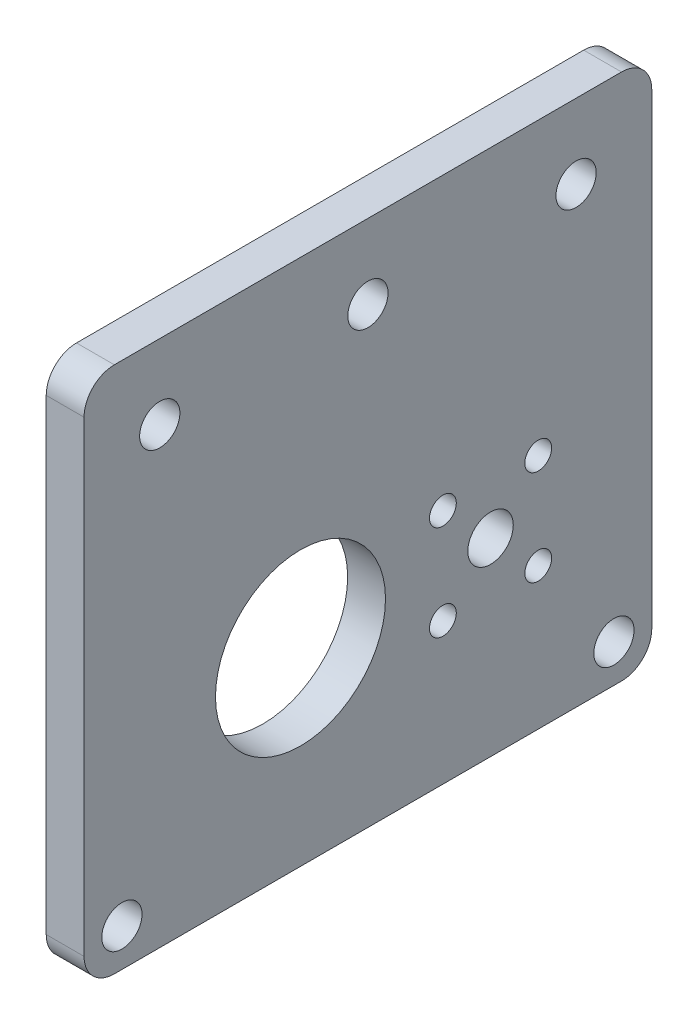
ISO-10303-21;
HEADER;
FILE_DESCRIPTION(('STEP AP214'),'2;1');
FILE_NAME('part.step','',(''),(''),'','','');
FILE_SCHEMA(('AUTOMOTIVE_DESIGN { 1 0 10303 214 1 1 1 1 }'));
ENDSEC;
DATA;
#1=APPLICATION_CONTEXT('core data for automotive mechanical design processes');
#2=APPLICATION_PROTOCOL_DEFINITION('international standard','automotive_design',2000,#1);
#3=PRODUCT_CONTEXT('',#1,'mechanical');
#4=PRODUCT('Part','Part','',(#3));
#5=PRODUCT_RELATED_PRODUCT_CATEGORY('part','',(#4));
#6=PRODUCT_DEFINITION_FORMATION('','',#4);
#7=PRODUCT_DEFINITION_CONTEXT('part definition',#1,'design');
#8=PRODUCT_DEFINITION('design','',#6,#7);
#9=PRODUCT_DEFINITION_SHAPE('','',#8);
#10=(LENGTH_UNIT() NAMED_UNIT(*) SI_UNIT(.MILLI.,.METRE.));
#11=(NAMED_UNIT(*) PLANE_ANGLE_UNIT() SI_UNIT($,.RADIAN.));
#12=(NAMED_UNIT(*) SI_UNIT($,.STERADIAN.) SOLID_ANGLE_UNIT());
#13=UNCERTAINTY_MEASURE_WITH_UNIT(LENGTH_MEASURE(1.E-05),#10,'distance_accuracy_value','');
#14=(GEOMETRIC_REPRESENTATION_CONTEXT(3) GLOBAL_UNCERTAINTY_ASSIGNED_CONTEXT((#13)) GLOBAL_UNIT_ASSIGNED_CONTEXT((#10,
#11,#12)) REPRESENTATION_CONTEXT('',''));
#15=CARTESIAN_POINT('',(0.,0.,0.));
#16=DIRECTION('',(0.,0.,1.));
#17=DIRECTION('',(1.,0.,0.));
#18=AXIS2_PLACEMENT_3D('',#15,#16,#17);
#19=CARTESIAN_POINT('',(6.35,0.,-27.05));
#20=DIRECTION('',(0.,0.,-1.));
#21=DIRECTION('',(0.,1.,0.));
#22=AXIS2_PLACEMENT_3D('',#19,#20,#21);
#23=PLANE('',#22);
#24=DIRECTION('',(0.,-1.,0.));
#25=VECTOR('',#24,1.);
#26=CARTESIAN_POINT('',(6.35,0.,-27.05));
#27=LINE('',#26,#25);
#28=CARTESIAN_POINT('',(6.35,51.67,-27.05));
#29=VERTEX_POINT('',#28);
#30=CARTESIAN_POINT('',(6.35,-26.67,-27.05));
#31=VERTEX_POINT('',#30);
#32=EDGE_CURVE('E168',#29,#31,#27,.T.);
#33=ORIENTED_EDGE('',*,*,#32,.T.);
#34=DIRECTION('',(-1.,0.,0.));
#35=VECTOR('',#34,1.);
#36=CARTESIAN_POINT('',(0.,-26.67,-27.05));
#37=LINE('',#36,#35);
#38=CARTESIAN_POINT('',(0.,-26.67,-27.05));
#39=VERTEX_POINT('',#38);
#40=EDGE_CURVE('E127',#31,#39,#37,.T.);
#41=ORIENTED_EDGE('',*,*,#40,.T.);
#42=DIRECTION('',(0.,-1.,0.));
#43=VECTOR('',#42,1.);
#44=CARTESIAN_POINT('',(0.,0.,-27.05));
#45=LINE('',#44,#43);
#46=CARTESIAN_POINT('',(0.,51.67,-27.05));
#47=VERTEX_POINT('',#46);
#48=EDGE_CURVE('E112',#47,#39,#45,.T.);
#49=ORIENTED_EDGE('',*,*,#48,.F.);
#50=DIRECTION('',(-1.,0.,0.));
#51=VECTOR('',#50,1.);
#52=CARTESIAN_POINT('',(6.35,51.67,-27.05));
#53=LINE('',#52,#51);
#54=EDGE_CURVE('E124',#47,#29,#53,.F.);
#55=ORIENTED_EDGE('',*,*,#54,.T.);
#56=EDGE_LOOP('',(#33,#41,#49,#55));
#57=FACE_BOUND('',#56,.T.);
#58=ADVANCED_FACE('F42',(#57),#23,.T.);
#59=CARTESIAN_POINT('',(6.35,56.75,0.));
#60=DIRECTION('',(0.,1.,0.));
#61=DIRECTION('',(0.,0.,1.));
#62=AXIS2_PLACEMENT_3D('',#59,#60,#61);
#63=PLANE('',#62);
#64=DIRECTION('',(0.,0.,-1.));
#65=VECTOR('',#64,1.);
#66=CARTESIAN_POINT('',(6.35,56.75,0.));
#67=LINE('',#66,#65);
#68=CARTESIAN_POINT('',(6.35,56.75,63.12));
#69=VERTEX_POINT('',#68);
#70=CARTESIAN_POINT('',(6.35,56.75,-21.97));
#71=VERTEX_POINT('',#70);
#72=EDGE_CURVE('E165',#69,#71,#67,.T.);
#73=ORIENTED_EDGE('',*,*,#72,.T.);
#74=DIRECTION('',(-1.,0.,0.));
#75=VECTOR('',#74,1.);
#76=CARTESIAN_POINT('',(6.35,56.75,-21.97));
#77=LINE('',#76,#75);
#78=CARTESIAN_POINT('',(0.,56.75,-21.97));
#79=VERTEX_POINT('',#78);
#80=EDGE_CURVE('E11',#71,#79,#77,.T.);
#81=ORIENTED_EDGE('',*,*,#80,.T.);
#82=DIRECTION('',(0.,0.,-1.));
#83=VECTOR('',#82,1.);
#84=CARTESIAN_POINT('',(0.,56.75,0.));
#85=LINE('',#84,#83);
#86=CARTESIAN_POINT('',(0.,56.75,63.12));
#87=VERTEX_POINT('',#86);
#88=EDGE_CURVE('E114',#87,#79,#85,.T.);
#89=ORIENTED_EDGE('',*,*,#88,.F.);
#90=DIRECTION('',(-1.,0.,0.));
#91=VECTOR('',#90,1.);
#92=CARTESIAN_POINT('',(6.35,56.75,63.12));
#93=LINE('',#92,#91);
#94=EDGE_CURVE('E50',#87,#69,#93,.F.);
#95=ORIENTED_EDGE('',*,*,#94,.T.);
#96=EDGE_LOOP('',(#73,#81,#89,#95));
#97=FACE_BOUND('',#96,.T.);
#98=ADVANCED_FACE('F164',(#97),#63,.T.);
#99=CARTESIAN_POINT('',(6.35,0.,68.2));
#100=DIRECTION('',(0.,0.,-1.));
#101=DIRECTION('',(-1.,0.,0.));
#102=AXIS2_PLACEMENT_3D('',#99,#100,#101);
#103=PLANE('',#102);
#104=DIRECTION('',(0.,-1.,0.));
#105=VECTOR('',#104,1.);
#106=CARTESIAN_POINT('',(0.,0.,68.2));
#107=LINE('',#106,#105);
#108=CARTESIAN_POINT('',(0.,51.67,68.2));
#109=VERTEX_POINT('',#108);
#110=CARTESIAN_POINT('',(0.,-26.67,68.2));
#111=VERTEX_POINT('',#110);
#112=EDGE_CURVE('E173',#109,#111,#107,.T.);
#113=ORIENTED_EDGE('',*,*,#112,.T.);
#114=DIRECTION('',(-1.,0.,0.));
#115=VECTOR('',#114,1.);
#116=CARTESIAN_POINT('',(6.35,-26.67,68.2));
#117=LINE('',#116,#115);
#118=CARTESIAN_POINT('',(6.35,-26.67,68.2));
#119=VERTEX_POINT('',#118);
#120=EDGE_CURVE('E57',#111,#119,#117,.F.);
#121=ORIENTED_EDGE('',*,*,#120,.T.);
#122=DIRECTION('',(0.,-1.,0.));
#123=VECTOR('',#122,1.);
#124=CARTESIAN_POINT('',(6.35,0.,68.2));
#125=LINE('',#124,#123);
#126=CARTESIAN_POINT('',(6.35,51.67,68.2));
#127=VERTEX_POINT('',#126);
#128=EDGE_CURVE('E137',#127,#119,#125,.T.);
#129=ORIENTED_EDGE('',*,*,#128,.F.);
#130=DIRECTION('',(-1.,0.,0.));
#131=VECTOR('',#130,1.);
#132=CARTESIAN_POINT('',(0.,51.67,68.2));
#133=LINE('',#132,#131);
#134=EDGE_CURVE('E158',#127,#109,#133,.T.);
#135=ORIENTED_EDGE('',*,*,#134,.T.);
#136=EDGE_LOOP('',(#113,#121,#129,#135));
#137=FACE_BOUND('',#136,.T.);
#138=ADVANCED_FACE('F172',(#137),#103,.F.);
#139=CARTESIAN_POINT('',(6.35,0.,0.));
#140=DIRECTION('',(-1.,0.,0.));
#141=DIRECTION('',(0.,0.,1.));
#142=AXIS2_PLACEMENT_3D('',#139,#140,#141);
#143=CYLINDRICAL_SURFACE('',#142,3.81);
#144=CARTESIAN_POINT('',(6.35,0.,0.));
#145=DIRECTION('',(1.,0.,0.));
#146=DIRECTION('',(0.,0.,-1.));
#147=AXIS2_PLACEMENT_3D('',#144,#145,#146);
#148=CIRCLE('',#147,3.81);
#149=CARTESIAN_POINT('',(6.35,0.,-3.81));
#150=VERTEX_POINT('',#149);
#151=EDGE_CURVE('E187',#150,#150,#148,.T.);
#152=ORIENTED_EDGE('',*,*,#151,.T.);
#153=EDGE_LOOP('',(#152));
#154=FACE_BOUND('',#153,.T.);
#155=CARTESIAN_POINT('',(0.,0.,0.));
#156=DIRECTION('',(1.,0.,0.));
#157=DIRECTION('',(0.,0.,-1.));
#158=AXIS2_PLACEMENT_3D('',#155,#156,#157);
#159=CIRCLE('',#158,3.81);
#160=CARTESIAN_POINT('',(0.,0.,-3.81));
#161=VERTEX_POINT('',#160);
#162=EDGE_CURVE('E128',#161,#161,#159,.T.);
#163=ORIENTED_EDGE('',*,*,#162,.F.);
#164=EDGE_LOOP('',(#163));
#165=FACE_BOUND('',#164,.T.);
#166=ADVANCED_FACE('F284',(#154,#165),#143,.F.);
#167=CARTESIAN_POINT('',(6.35,0.,31.8887));
#168=DIRECTION('',(-1.,0.,0.));
#169=DIRECTION('',(0.,0.,1.));
#170=AXIS2_PLACEMENT_3D('',#167,#168,#169);
#171=CYLINDRICAL_SURFACE('',#170,14.2621);
#172=CARTESIAN_POINT('',(6.35,0.,31.8887));
#173=DIRECTION('',(1.,0.,0.));
#174=DIRECTION('',(0.,0.,-1.));
#175=AXIS2_PLACEMENT_3D('',#172,#173,#174);
#176=CIRCLE('',#175,14.2621);
#177=CARTESIAN_POINT('',(6.35,0.,17.6266));
#178=VERTEX_POINT('',#177);
#179=EDGE_CURVE('E176',#178,#178,#176,.T.);
#180=ORIENTED_EDGE('',*,*,#179,.T.);
#181=EDGE_LOOP('',(#180));
#182=FACE_BOUND('',#181,.T.);
#183=CARTESIAN_POINT('',(0.,0.,31.8887));
#184=DIRECTION('',(1.,0.,0.));
#185=DIRECTION('',(0.,0.,-1.));
#186=AXIS2_PLACEMENT_3D('',#183,#184,#185);
#187=CIRCLE('',#186,14.2621);
#188=CARTESIAN_POINT('',(0.,0.,17.6266));
#189=VERTEX_POINT('',#188);
#190=EDGE_CURVE('E181',#189,#189,#187,.T.);
#191=ORIENTED_EDGE('',*,*,#190,.F.);
#192=EDGE_LOOP('',(#191));
#193=FACE_BOUND('',#192,.T.);
#194=ADVANCED_FACE('F286',(#182,#193),#171,.F.);
#195=CARTESIAN_POINT('',(6.35,-31.75,0.));
#196=DIRECTION('',(0.,1.,0.));
#197=DIRECTION('',(0.,0.,1.));
#198=AXIS2_PLACEMENT_3D('',#195,#196,#197);
#199=PLANE('',#198);
#200=DIRECTION('',(0.,0.,-1.));
#201=VECTOR('',#200,1.);
#202=CARTESIAN_POINT('',(0.,-31.75,0.));
#203=LINE('',#202,#201);
#204=CARTESIAN_POINT('',(0.,-31.75,63.12));
#205=VERTEX_POINT('',#204);
#206=CARTESIAN_POINT('',(0.,-31.75,-21.97));
#207=VERTEX_POINT('',#206);
#208=EDGE_CURVE('E140',#205,#207,#203,.T.);
#209=ORIENTED_EDGE('',*,*,#208,.T.);
#210=DIRECTION('',(-1.,0.,0.));
#211=VECTOR('',#210,1.);
#212=CARTESIAN_POINT('',(6.35,-31.75,-21.97));
#213=LINE('',#212,#211);
#214=CARTESIAN_POINT('',(6.35,-31.75,-21.97));
#215=VERTEX_POINT('',#214);
#216=EDGE_CURVE('E150',#207,#215,#213,.F.);
#217=ORIENTED_EDGE('',*,*,#216,.T.);
#218=DIRECTION('',(0.,0.,-1.));
#219=VECTOR('',#218,1.);
#220=CARTESIAN_POINT('',(6.35,-31.75,0.));
#221=LINE('',#220,#219);
#222=CARTESIAN_POINT('',(6.35,-31.75,63.12));
#223=VERTEX_POINT('',#222);
#224=EDGE_CURVE('E133',#223,#215,#221,.T.);
#225=ORIENTED_EDGE('',*,*,#224,.F.);
#226=DIRECTION('',(-1.,0.,0.));
#227=VECTOR('',#226,1.);
#228=CARTESIAN_POINT('',(6.35,-31.75,63.12));
#229=LINE('',#228,#227);
#230=EDGE_CURVE('E147',#223,#205,#229,.T.);
#231=ORIENTED_EDGE('',*,*,#230,.T.);
#232=EDGE_LOOP('',(#209,#217,#225,#231));
#233=FACE_BOUND('',#232,.T.);
#234=ADVANCED_FACE('F293',(#233),#199,.F.);
#235=CARTESIAN_POINT('',(6.35,0.,0.));
#236=DIRECTION('',(1.,0.,0.));
#237=DIRECTION('',(0.,0.,-1.));
#238=AXIS2_PLACEMENT_3D('',#235,#236,#237);
#239=PLANE('',#238);
#240=CARTESIAN_POINT('',(6.34999999999999,8.,-8.));
#241=DIRECTION('',(-1.,0.,0.));
#242=DIRECTION('',(0.,0.,1.));
#243=AXIS2_PLACEMENT_3D('',#240,#241,#242);
#244=CIRCLE('',#243,2.24999999999999);
#245=CARTESIAN_POINT('',(6.34999999999999,8.,-5.75000000000001));
#246=VERTEX_POINT('',#245);
#247=EDGE_CURVE('E248',#246,#246,#244,.T.);
#248=ORIENTED_EDGE('',*,*,#247,.T.);
#249=EDGE_LOOP('',(#248));
#250=FACE_BOUND('',#249,.T.);
#251=CARTESIAN_POINT('',(6.34999999999999,8.,8.));
#252=DIRECTION('',(-1.,0.,0.));
#253=DIRECTION('',(0.,0.,1.));
#254=AXIS2_PLACEMENT_3D('',#251,#252,#253);
#255=CIRCLE('',#254,2.24999999999999);
#256=CARTESIAN_POINT('',(6.34999999999999,8.,10.25));
#257=VERTEX_POINT('',#256);
#258=EDGE_CURVE('E239',#257,#257,#255,.T.);
#259=ORIENTED_EDGE('',*,*,#258,.T.);
#260=EDGE_LOOP('',(#259));
#261=FACE_BOUND('',#260,.T.);
#262=CARTESIAN_POINT('',(6.34999999999999,-8.,8.));
#263=DIRECTION('',(-1.,0.,0.));
#264=DIRECTION('',(0.,0.,1.));
#265=AXIS2_PLACEMENT_3D('',#262,#263,#264);
#266=CIRCLE('',#265,2.24999999999999);
#267=CARTESIAN_POINT('',(6.34999999999999,-8.,10.25));
#268=VERTEX_POINT('',#267);
#269=EDGE_CURVE('E230',#268,#268,#266,.T.);
#270=ORIENTED_EDGE('',*,*,#269,.T.);
#271=EDGE_LOOP('',(#270));
#272=FACE_BOUND('',#271,.T.);
#273=CARTESIAN_POINT('',(6.34999999999999,-8.,-8.));
#274=DIRECTION('',(-1.,0.,0.));
#275=DIRECTION('',(0.,0.,1.));
#276=AXIS2_PLACEMENT_3D('',#273,#274,#275);
#277=CIRCLE('',#276,2.24999999999999);
#278=CARTESIAN_POINT('',(6.34999999999999,-8.,-5.75000000000001));
#279=VERTEX_POINT('',#278);
#280=EDGE_CURVE('E221',#279,#279,#277,.T.);
#281=ORIENTED_EDGE('',*,*,#280,.T.);
#282=EDGE_LOOP('',(#281));
#283=FACE_BOUND('',#282,.T.);
#284=CARTESIAN_POINT('',(6.35,44.25,55.5));
#285=DIRECTION('',(1.,0.,0.));
#286=DIRECTION('',(0.,0.,-1.));
#287=AXIS2_PLACEMENT_3D('',#284,#285,#286);
#288=CIRCLE('',#287,3.37819999999998);
#289=CARTESIAN_POINT('',(6.35,44.25,52.1218));
#290=VERTEX_POINT('',#289);
#291=EDGE_CURVE('E218',#290,#290,#288,.T.);
#292=ORIENTED_EDGE('',*,*,#291,.F.);
#293=EDGE_LOOP('',(#292));
#294=FACE_BOUND('',#293,.T.);
#295=CARTESIAN_POINT('',(6.35,44.25,20.575));
#296=DIRECTION('',(1.,0.,0.));
#297=DIRECTION('',(0.,0.,-1.));
#298=AXIS2_PLACEMENT_3D('',#295,#296,#297);
#299=CIRCLE('',#298,3.37819999999998);
#300=CARTESIAN_POINT('',(6.35,44.25,17.1968));
#301=VERTEX_POINT('',#300);
#302=EDGE_CURVE('E212',#301,#301,#299,.T.);
#303=ORIENTED_EDGE('',*,*,#302,.F.);
#304=EDGE_LOOP('',(#303));
#305=FACE_BOUND('',#304,.T.);
#306=CARTESIAN_POINT('',(6.35,44.25,-14.35));
#307=DIRECTION('',(1.,0.,0.));
#308=DIRECTION('',(0.,0.,-1.));
#309=AXIS2_PLACEMENT_3D('',#306,#307,#308);
#310=CIRCLE('',#309,3.37819999999998);
#311=CARTESIAN_POINT('',(6.35,44.25,-17.7282));
#312=VERTEX_POINT('',#311);
#313=EDGE_CURVE('E206',#312,#312,#310,.T.);
#314=ORIENTED_EDGE('',*,*,#313,.F.);
#315=EDGE_LOOP('',(#314));
#316=FACE_BOUND('',#315,.T.);
#317=CARTESIAN_POINT('',(6.35,-25.4,61.85));
#318=DIRECTION('',(1.,0.,0.));
#319=DIRECTION('',(0.,0.,-1.));
#320=AXIS2_PLACEMENT_3D('',#317,#318,#319);
#321=CIRCLE('',#320,3.37819999999999);
#322=CARTESIAN_POINT('',(6.35,-25.4,58.4718));
#323=VERTEX_POINT('',#322);
#324=EDGE_CURVE('E200',#323,#323,#321,.T.);
#325=ORIENTED_EDGE('',*,*,#324,.F.);
#326=EDGE_LOOP('',(#325));
#327=FACE_BOUND('',#326,.T.);
#328=CARTESIAN_POINT('',(6.35,-25.4,-20.7));
#329=DIRECTION('',(1.,0.,0.));
#330=DIRECTION('',(0.,0.,-1.));
#331=AXIS2_PLACEMENT_3D('',#328,#329,#330);
#332=CIRCLE('',#331,3.37819999999999);
#333=CARTESIAN_POINT('',(6.35,-25.4,-24.0782));
#334=VERTEX_POINT('',#333);
#335=EDGE_CURVE('E194',#334,#334,#332,.T.);
#336=ORIENTED_EDGE('',*,*,#335,.F.);
#337=EDGE_LOOP('',(#336));
#338=FACE_BOUND('',#337,.T.);
#339=ORIENTED_EDGE('',*,*,#179,.F.);
#340=EDGE_LOOP('',(#339));
#341=FACE_BOUND('',#340,.T.);
#342=ORIENTED_EDGE('',*,*,#151,.F.);
#343=EDGE_LOOP('',(#342));
#344=FACE_BOUND('',#343,.T.);
#345=ORIENTED_EDGE('',*,*,#224,.T.);
#346=CARTESIAN_POINT('',(6.35,-26.67,-21.97));
#347=DIRECTION('',(1.,0.,0.));
#348=DIRECTION('',(0.,0.,-1.));
#349=AXIS2_PLACEMENT_3D('',#346,#347,#348);
#350=CIRCLE('',#349,5.08);
#351=EDGE_CURVE('E156',#215,#31,#350,.T.);
#352=ORIENTED_EDGE('',*,*,#351,.T.);
#353=ORIENTED_EDGE('',*,*,#32,.F.);
#354=CARTESIAN_POINT('',(6.35,51.67,-21.97));
#355=DIRECTION('',(1.,0.,0.));
#356=DIRECTION('',(0.,0.,-1.));
#357=AXIS2_PLACEMENT_3D('',#354,#355,#356);
#358=CIRCLE('',#357,5.08);
#359=EDGE_CURVE('E132',#29,#71,#358,.T.);
#360=ORIENTED_EDGE('',*,*,#359,.T.);
#361=ORIENTED_EDGE('',*,*,#72,.F.);
#362=CARTESIAN_POINT('',(6.35,51.67,63.12));
#363=DIRECTION('',(1.,0.,0.));
#364=DIRECTION('',(0.,0.,-1.));
#365=AXIS2_PLACEMENT_3D('',#362,#363,#364);
#366=CIRCLE('',#365,5.08);
#367=EDGE_CURVE('E64',#69,#127,#366,.T.);
#368=ORIENTED_EDGE('',*,*,#367,.T.);
#369=ORIENTED_EDGE('',*,*,#128,.T.);
#370=CARTESIAN_POINT('',(6.35,-26.67,63.12));
#371=DIRECTION('',(1.,0.,0.));
#372=DIRECTION('',(0.,0.,-1.));
#373=AXIS2_PLACEMENT_3D('',#370,#371,#372);
#374=CIRCLE('',#373,5.08);
#375=EDGE_CURVE('E154',#119,#223,#374,.T.);
#376=ORIENTED_EDGE('',*,*,#375,.T.);
#377=EDGE_LOOP('',(#345,#352,#353,#360,#361,#368,#369,#376));
#378=FACE_BOUND('',#377,.T.);
#379=ADVANCED_FACE('F167',(#250,#261,#272,#283,#294,#305,#316,#327,#338,#341,#344,#378),#239,.T.);
#380=CARTESIAN_POINT('',(0.,0.,0.));
#381=DIRECTION('',(1.,0.,0.));
#382=DIRECTION('',(0.,0.,-1.));
#383=AXIS2_PLACEMENT_3D('',#380,#381,#382);
#384=PLANE('',#383);
#385=CARTESIAN_POINT('',(0.,8.,-8.));
#386=DIRECTION('',(-1.,0.,0.));
#387=DIRECTION('',(0.,0.,1.));
#388=AXIS2_PLACEMENT_3D('',#385,#386,#387);
#389=CIRCLE('',#388,4.7);
#390=CARTESIAN_POINT('',(0.,8.,-3.3));
#391=VERTEX_POINT('',#390);
#392=EDGE_CURVE('E254',#391,#391,#389,.T.);
#393=ORIENTED_EDGE('',*,*,#392,.F.);
#394=EDGE_LOOP('',(#393));
#395=FACE_BOUND('',#394,.T.);
#396=CARTESIAN_POINT('',(0.,8.,8.));
#397=DIRECTION('',(-1.,0.,0.));
#398=DIRECTION('',(0.,0.,1.));
#399=AXIS2_PLACEMENT_3D('',#396,#397,#398);
#400=CIRCLE('',#399,4.7);
#401=CARTESIAN_POINT('',(0.,8.,12.7));
#402=VERTEX_POINT('',#401);
#403=EDGE_CURVE('E245',#402,#402,#400,.T.);
#404=ORIENTED_EDGE('',*,*,#403,.F.);
#405=EDGE_LOOP('',(#404));
#406=FACE_BOUND('',#405,.T.);
#407=CARTESIAN_POINT('',(0.,-8.,8.));
#408=DIRECTION('',(-1.,0.,0.));
#409=DIRECTION('',(0.,0.,1.));
#410=AXIS2_PLACEMENT_3D('',#407,#408,#409);
#411=CIRCLE('',#410,4.7);
#412=CARTESIAN_POINT('',(0.,-8.,12.7));
#413=VERTEX_POINT('',#412);
#414=EDGE_CURVE('E236',#413,#413,#411,.T.);
#415=ORIENTED_EDGE('',*,*,#414,.F.);
#416=EDGE_LOOP('',(#415));
#417=FACE_BOUND('',#416,.T.);
#418=CARTESIAN_POINT('',(0.,-8.,-8.));
#419=DIRECTION('',(-1.,0.,0.));
#420=DIRECTION('',(0.,0.,1.));
#421=AXIS2_PLACEMENT_3D('',#418,#419,#420);
#422=CIRCLE('',#421,4.7);
#423=CARTESIAN_POINT('',(0.,-8.,-3.3));
#424=VERTEX_POINT('',#423);
#425=EDGE_CURVE('E227',#424,#424,#422,.T.);
#426=ORIENTED_EDGE('',*,*,#425,.F.);
#427=EDGE_LOOP('',(#426));
#428=FACE_BOUND('',#427,.T.);
#429=CARTESIAN_POINT('',(0.,44.25,55.5));
#430=DIRECTION('',(1.,0.,0.));
#431=DIRECTION('',(0.,0.,-1.));
#432=AXIS2_PLACEMENT_3D('',#429,#430,#431);
#433=CIRCLE('',#432,3.37819999999998);
#434=CARTESIAN_POINT('',(0.,44.25,52.1218));
#435=VERTEX_POINT('',#434);
#436=EDGE_CURVE('E215',#435,#435,#433,.T.);
#437=ORIENTED_EDGE('',*,*,#436,.T.);
#438=EDGE_LOOP('',(#437));
#439=FACE_BOUND('',#438,.T.);
#440=CARTESIAN_POINT('',(0.,44.25,20.575));
#441=DIRECTION('',(1.,0.,0.));
#442=DIRECTION('',(0.,0.,-1.));
#443=AXIS2_PLACEMENT_3D('',#440,#441,#442);
#444=CIRCLE('',#443,3.37819999999998);
#445=CARTESIAN_POINT('',(0.,44.25,17.1968));
#446=VERTEX_POINT('',#445);
#447=EDGE_CURVE('E209',#446,#446,#444,.T.);
#448=ORIENTED_EDGE('',*,*,#447,.T.);
#449=EDGE_LOOP('',(#448));
#450=FACE_BOUND('',#449,.T.);
#451=CARTESIAN_POINT('',(0.,44.25,-14.35));
#452=DIRECTION('',(1.,0.,0.));
#453=DIRECTION('',(0.,0.,-1.));
#454=AXIS2_PLACEMENT_3D('',#451,#452,#453);
#455=CIRCLE('',#454,3.37819999999998);
#456=CARTESIAN_POINT('',(0.,44.25,-17.7282));
#457=VERTEX_POINT('',#456);
#458=EDGE_CURVE('E203',#457,#457,#455,.T.);
#459=ORIENTED_EDGE('',*,*,#458,.T.);
#460=EDGE_LOOP('',(#459));
#461=FACE_BOUND('',#460,.T.);
#462=CARTESIAN_POINT('',(0.,-25.4,61.85));
#463=DIRECTION('',(1.,0.,0.));
#464=DIRECTION('',(0.,0.,-1.));
#465=AXIS2_PLACEMENT_3D('',#462,#463,#464);
#466=CIRCLE('',#465,3.37819999999999);
#467=CARTESIAN_POINT('',(0.,-25.4,58.4718));
#468=VERTEX_POINT('',#467);
#469=EDGE_CURVE('E197',#468,#468,#466,.T.);
#470=ORIENTED_EDGE('',*,*,#469,.T.);
#471=EDGE_LOOP('',(#470));
#472=FACE_BOUND('',#471,.T.);
#473=CARTESIAN_POINT('',(0.,-25.4,-20.7));
#474=DIRECTION('',(1.,0.,0.));
#475=DIRECTION('',(0.,0.,-1.));
#476=AXIS2_PLACEMENT_3D('',#473,#474,#475);
#477=CIRCLE('',#476,3.37819999999999);
#478=CARTESIAN_POINT('',(0.,-25.4,-24.0782));
#479=VERTEX_POINT('',#478);
#480=EDGE_CURVE('E183',#479,#479,#477,.T.);
#481=ORIENTED_EDGE('',*,*,#480,.T.);
#482=EDGE_LOOP('',(#481));
#483=FACE_BOUND('',#482,.T.);
#484=ORIENTED_EDGE('',*,*,#190,.T.);
#485=EDGE_LOOP('',(#484));
#486=FACE_BOUND('',#485,.T.);
#487=ORIENTED_EDGE('',*,*,#162,.T.);
#488=EDGE_LOOP('',(#487));
#489=FACE_BOUND('',#488,.T.);
#490=ORIENTED_EDGE('',*,*,#48,.T.);
#491=CARTESIAN_POINT('',(0.,-26.67,-21.97));
#492=DIRECTION('',(1.,0.,0.));
#493=DIRECTION('',(0.,0.,-1.));
#494=AXIS2_PLACEMENT_3D('',#491,#492,#493);
#495=CIRCLE('',#494,5.08);
#496=EDGE_CURVE('E145',#39,#207,#495,.F.);
#497=ORIENTED_EDGE('',*,*,#496,.T.);
#498=ORIENTED_EDGE('',*,*,#208,.F.);
#499=CARTESIAN_POINT('',(0.,-26.67,63.12));
#500=DIRECTION('',(1.,0.,0.));
#501=DIRECTION('',(0.,0.,-1.));
#502=AXIS2_PLACEMENT_3D('',#499,#500,#501);
#503=CIRCLE('',#502,5.08);
#504=EDGE_CURVE('E118',#205,#111,#503,.F.);
#505=ORIENTED_EDGE('',*,*,#504,.T.);
#506=ORIENTED_EDGE('',*,*,#112,.F.);
#507=CARTESIAN_POINT('',(0.,51.67,63.12));
#508=DIRECTION('',(1.,0.,0.));
#509=DIRECTION('',(0.,0.,-1.));
#510=AXIS2_PLACEMENT_3D('',#507,#508,#509);
#511=CIRCLE('',#510,5.08);
#512=EDGE_CURVE('E119',#109,#87,#511,.F.);
#513=ORIENTED_EDGE('',*,*,#512,.T.);
#514=ORIENTED_EDGE('',*,*,#88,.T.);
#515=CARTESIAN_POINT('',(0.,51.67,-21.97));
#516=DIRECTION('',(1.,0.,0.));
#517=DIRECTION('',(0.,0.,-1.));
#518=AXIS2_PLACEMENT_3D('',#515,#516,#517);
#519=CIRCLE('',#518,5.08);
#520=EDGE_CURVE('E109',#79,#47,#519,.F.);
#521=ORIENTED_EDGE('',*,*,#520,.T.);
#522=EDGE_LOOP('',(#490,#497,#498,#505,#506,#513,#514,#521));
#523=FACE_BOUND('',#522,.T.);
#524=ADVANCED_FACE('F111',(#395,#406,#417,#428,#439,#450,#461,#472,#483,#486,#489,#523),#384,.F.);
#525=CARTESIAN_POINT('',(6.35,-25.4,-20.7));
#526=DIRECTION('',(1.,0.,0.));
#527=DIRECTION('',(0.,0.,-1.));
#528=AXIS2_PLACEMENT_3D('',#525,#526,#527);
#529=CYLINDRICAL_SURFACE('',#528,3.37819999999999);
#530=ORIENTED_EDGE('',*,*,#480,.F.);
#531=EDGE_LOOP('',(#530));
#532=FACE_BOUND('',#531,.T.);
#533=ORIENTED_EDGE('',*,*,#335,.T.);
#534=EDGE_LOOP('',(#533));
#535=FACE_BOUND('',#534,.T.);
#536=ADVANCED_FACE('F262',(#532,#535),#529,.F.);
#537=CARTESIAN_POINT('',(6.35,-25.4,61.85));
#538=DIRECTION('',(1.,0.,0.));
#539=DIRECTION('',(0.,0.,-1.));
#540=AXIS2_PLACEMENT_3D('',#537,#538,#539);
#541=CYLINDRICAL_SURFACE('',#540,3.37819999999999);
#542=ORIENTED_EDGE('',*,*,#469,.F.);
#543=EDGE_LOOP('',(#542));
#544=FACE_BOUND('',#543,.T.);
#545=ORIENTED_EDGE('',*,*,#324,.T.);
#546=EDGE_LOOP('',(#545));
#547=FACE_BOUND('',#546,.T.);
#548=ADVANCED_FACE('F312',(#544,#547),#541,.F.);
#549=CARTESIAN_POINT('',(6.35,44.25,-14.35));
#550=DIRECTION('',(1.,0.,0.));
#551=DIRECTION('',(0.,0.,-1.));
#552=AXIS2_PLACEMENT_3D('',#549,#550,#551);
#553=CYLINDRICAL_SURFACE('',#552,3.37819999999998);
#554=ORIENTED_EDGE('',*,*,#458,.F.);
#555=EDGE_LOOP('',(#554));
#556=FACE_BOUND('',#555,.T.);
#557=ORIENTED_EDGE('',*,*,#313,.T.);
#558=EDGE_LOOP('',(#557));
#559=FACE_BOUND('',#558,.T.);
#560=ADVANCED_FACE('F316',(#556,#559),#553,.F.);
#561=CARTESIAN_POINT('',(6.35,44.25,20.575));
#562=DIRECTION('',(1.,0.,0.));
#563=DIRECTION('',(0.,0.,-1.));
#564=AXIS2_PLACEMENT_3D('',#561,#562,#563);
#565=CYLINDRICAL_SURFACE('',#564,3.37819999999998);
#566=ORIENTED_EDGE('',*,*,#447,.F.);
#567=EDGE_LOOP('',(#566));
#568=FACE_BOUND('',#567,.T.);
#569=ORIENTED_EDGE('',*,*,#302,.T.);
#570=EDGE_LOOP('',(#569));
#571=FACE_BOUND('',#570,.T.);
#572=ADVANCED_FACE('F320',(#568,#571),#565,.F.);
#573=CARTESIAN_POINT('',(6.35,44.25,55.5));
#574=DIRECTION('',(1.,0.,0.));
#575=DIRECTION('',(0.,0.,-1.));
#576=AXIS2_PLACEMENT_3D('',#573,#574,#575);
#577=CYLINDRICAL_SURFACE('',#576,3.37819999999998);
#578=ORIENTED_EDGE('',*,*,#436,.F.);
#579=EDGE_LOOP('',(#578));
#580=FACE_BOUND('',#579,.T.);
#581=ORIENTED_EDGE('',*,*,#291,.T.);
#582=EDGE_LOOP('',(#581));
#583=FACE_BOUND('',#582,.T.);
#584=ADVANCED_FACE('F324',(#580,#583),#577,.F.);
#585=CARTESIAN_POINT('',(6.35,-26.67,-21.97));
#586=DIRECTION('',(1.,0.,0.));
#587=DIRECTION('',(0.,0.,-1.));
#588=AXIS2_PLACEMENT_3D('',#585,#586,#587);
#589=CYLINDRICAL_SURFACE('',#588,5.08);
#590=ORIENTED_EDGE('',*,*,#351,.F.);
#591=ORIENTED_EDGE('',*,*,#216,.F.);
#592=ORIENTED_EDGE('',*,*,#496,.F.);
#593=ORIENTED_EDGE('',*,*,#40,.F.);
#594=EDGE_LOOP('',(#590,#591,#592,#593));
#595=FACE_BOUND('',#594,.T.);
#596=ADVANCED_FACE('F328',(#595),#589,.T.);
#597=CARTESIAN_POINT('',(6.35,-26.67,63.12));
#598=DIRECTION('',(-1.,0.,0.));
#599=DIRECTION('',(0.,0.,1.));
#600=AXIS2_PLACEMENT_3D('',#597,#598,#599);
#601=CYLINDRICAL_SURFACE('',#600,5.08);
#602=ORIENTED_EDGE('',*,*,#375,.F.);
#603=ORIENTED_EDGE('',*,*,#120,.F.);
#604=ORIENTED_EDGE('',*,*,#504,.F.);
#605=ORIENTED_EDGE('',*,*,#230,.F.);
#606=EDGE_LOOP('',(#602,#603,#604,#605));
#607=FACE_BOUND('',#606,.T.);
#608=ADVANCED_FACE('F405',(#607),#601,.T.);
#609=CARTESIAN_POINT('',(6.35,51.67,-21.97));
#610=DIRECTION('',(-1.,0.,0.));
#611=DIRECTION('',(0.,0.,1.));
#612=AXIS2_PLACEMENT_3D('',#609,#610,#611);
#613=CYLINDRICAL_SURFACE('',#612,5.08);
#614=ORIENTED_EDGE('',*,*,#359,.F.);
#615=ORIENTED_EDGE('',*,*,#54,.F.);
#616=ORIENTED_EDGE('',*,*,#520,.F.);
#617=ORIENTED_EDGE('',*,*,#80,.F.);
#618=EDGE_LOOP('',(#614,#615,#616,#617));
#619=FACE_BOUND('',#618,.T.);
#620=ADVANCED_FACE('F131',(#619),#613,.T.);
#621=CARTESIAN_POINT('',(6.35,51.67,63.12));
#622=DIRECTION('',(1.,0.,0.));
#623=DIRECTION('',(0.,0.,-1.));
#624=AXIS2_PLACEMENT_3D('',#621,#622,#623);
#625=CYLINDRICAL_SURFACE('',#624,5.08);
#626=ORIENTED_EDGE('',*,*,#367,.F.);
#627=ORIENTED_EDGE('',*,*,#94,.F.);
#628=ORIENTED_EDGE('',*,*,#512,.F.);
#629=ORIENTED_EDGE('',*,*,#134,.F.);
#630=EDGE_LOOP('',(#626,#627,#628,#629));
#631=FACE_BOUND('',#630,.T.);
#632=ADVANCED_FACE('F44',(#631),#625,.T.);
#633=CARTESIAN_POINT('',(0.,-8.,-8.));
#634=DIRECTION('',(-1.,0.,0.));
#635=DIRECTION('',(0.,0.,1.));
#636=AXIS2_PLACEMENT_3D('',#633,#634,#635);
#637=CYLINDRICAL_SURFACE('',#636,2.24999999999999);
#638=ORIENTED_EDGE('',*,*,#280,.F.);
#639=EDGE_LOOP('',(#638));
#640=FACE_BOUND('',#639,.T.);
#641=CARTESIAN_POINT('',(2.45000000000001,-8.,-8.));
#642=DIRECTION('',(-1.,0.,0.));
#643=DIRECTION('',(0.,0.,1.));
#644=AXIS2_PLACEMENT_3D('',#641,#642,#643);
#645=CIRCLE('',#644,2.24999999999999);
#646=CARTESIAN_POINT('',(2.45000000000001,-8.,-5.75000000000001));
#647=VERTEX_POINT('',#646);
#648=EDGE_CURVE('E224',#647,#647,#645,.T.);
#649=ORIENTED_EDGE('',*,*,#648,.T.);
#650=EDGE_LOOP('',(#649));
#651=FACE_BOUND('',#650,.T.);
#652=ADVANCED_FACE('F330',(#640,#651),#637,.F.);
#653=CARTESIAN_POINT('',(0.,-8.,-8.));
#654=DIRECTION('',(-1.,0.,0.));
#655=DIRECTION('',(0.,0.,1.));
#656=AXIS2_PLACEMENT_3D('',#653,#654,#655);
#657=CONICAL_SURFACE('',#656,4.7,0.785398163397449);
#658=ORIENTED_EDGE('',*,*,#648,.F.);
#659=EDGE_LOOP('',(#658));
#660=FACE_BOUND('',#659,.T.);
#661=ORIENTED_EDGE('',*,*,#425,.T.);
#662=EDGE_LOOP('',(#661));
#663=FACE_BOUND('',#662,.T.);
#664=ADVANCED_FACE('F333',(#660,#663),#657,.F.);
#665=CARTESIAN_POINT('',(0.,-8.,8.));
#666=DIRECTION('',(-1.,0.,0.));
#667=DIRECTION('',(0.,0.,1.));
#668=AXIS2_PLACEMENT_3D('',#665,#666,#667);
#669=CYLINDRICAL_SURFACE('',#668,2.24999999999999);
#670=ORIENTED_EDGE('',*,*,#269,.F.);
#671=EDGE_LOOP('',(#670));
#672=FACE_BOUND('',#671,.T.);
#673=CARTESIAN_POINT('',(2.45000000000001,-8.,8.));
#674=DIRECTION('',(-1.,0.,0.));
#675=DIRECTION('',(0.,0.,1.));
#676=AXIS2_PLACEMENT_3D('',#673,#674,#675);
#677=CIRCLE('',#676,2.24999999999999);
#678=CARTESIAN_POINT('',(2.45000000000001,-8.,10.25));
#679=VERTEX_POINT('',#678);
#680=EDGE_CURVE('E233',#679,#679,#677,.T.);
#681=ORIENTED_EDGE('',*,*,#680,.T.);
#682=EDGE_LOOP('',(#681));
#683=FACE_BOUND('',#682,.T.);
#684=ADVANCED_FACE('F337',(#672,#683),#669,.F.);
#685=CARTESIAN_POINT('',(0.,-8.,8.));
#686=DIRECTION('',(-1.,0.,0.));
#687=DIRECTION('',(0.,0.,1.));
#688=AXIS2_PLACEMENT_3D('',#685,#686,#687);
#689=CONICAL_SURFACE('',#688,4.7,0.785398163397449);
#690=ORIENTED_EDGE('',*,*,#680,.F.);
#691=EDGE_LOOP('',(#690));
#692=FACE_BOUND('',#691,.T.);
#693=ORIENTED_EDGE('',*,*,#414,.T.);
#694=EDGE_LOOP('',(#693));
#695=FACE_BOUND('',#694,.T.);
#696=ADVANCED_FACE('F341',(#692,#695),#689,.F.);
#697=CARTESIAN_POINT('',(0.,8.,8.));
#698=DIRECTION('',(-1.,0.,0.));
#699=DIRECTION('',(0.,0.,1.));
#700=AXIS2_PLACEMENT_3D('',#697,#698,#699);
#701=CYLINDRICAL_SURFACE('',#700,2.24999999999999);
#702=ORIENTED_EDGE('',*,*,#258,.F.);
#703=EDGE_LOOP('',(#702));
#704=FACE_BOUND('',#703,.T.);
#705=CARTESIAN_POINT('',(2.45000000000001,8.,8.));
#706=DIRECTION('',(-1.,0.,0.));
#707=DIRECTION('',(0.,0.,1.));
#708=AXIS2_PLACEMENT_3D('',#705,#706,#707);
#709=CIRCLE('',#708,2.24999999999999);
#710=CARTESIAN_POINT('',(2.45000000000001,8.,10.25));
#711=VERTEX_POINT('',#710);
#712=EDGE_CURVE('E242',#711,#711,#709,.T.);
#713=ORIENTED_EDGE('',*,*,#712,.T.);
#714=EDGE_LOOP('',(#713));
#715=FACE_BOUND('',#714,.T.);
#716=ADVANCED_FACE('F345',(#704,#715),#701,.F.);
#717=CARTESIAN_POINT('',(0.,8.,8.));
#718=DIRECTION('',(-1.,0.,0.));
#719=DIRECTION('',(0.,0.,1.));
#720=AXIS2_PLACEMENT_3D('',#717,#718,#719);
#721=CONICAL_SURFACE('',#720,4.7,0.785398163397449);
#722=ORIENTED_EDGE('',*,*,#712,.F.);
#723=EDGE_LOOP('',(#722));
#724=FACE_BOUND('',#723,.T.);
#725=ORIENTED_EDGE('',*,*,#403,.T.);
#726=EDGE_LOOP('',(#725));
#727=FACE_BOUND('',#726,.T.);
#728=ADVANCED_FACE('F349',(#724,#727),#721,.F.);
#729=CARTESIAN_POINT('',(0.,8.,-8.));
#730=DIRECTION('',(-1.,0.,0.));
#731=DIRECTION('',(0.,0.,1.));
#732=AXIS2_PLACEMENT_3D('',#729,#730,#731);
#733=CYLINDRICAL_SURFACE('',#732,2.24999999999999);
#734=ORIENTED_EDGE('',*,*,#247,.F.);
#735=EDGE_LOOP('',(#734));
#736=FACE_BOUND('',#735,.T.);
#737=CARTESIAN_POINT('',(2.45000000000001,8.,-8.));
#738=DIRECTION('',(-1.,0.,0.));
#739=DIRECTION('',(0.,0.,1.));
#740=AXIS2_PLACEMENT_3D('',#737,#738,#739);
#741=CIRCLE('',#740,2.24999999999999);
#742=CARTESIAN_POINT('',(2.45000000000001,8.,-5.75000000000001));
#743=VERTEX_POINT('',#742);
#744=EDGE_CURVE('E251',#743,#743,#741,.T.);
#745=ORIENTED_EDGE('',*,*,#744,.T.);
#746=EDGE_LOOP('',(#745));
#747=FACE_BOUND('',#746,.T.);
#748=ADVANCED_FACE('F353',(#736,#747),#733,.F.);
#749=CARTESIAN_POINT('',(0.,8.,-8.));
#750=DIRECTION('',(-1.,0.,0.));
#751=DIRECTION('',(0.,0.,1.));
#752=AXIS2_PLACEMENT_3D('',#749,#750,#751);
#753=CONICAL_SURFACE('',#752,4.7,0.785398163397449);
#754=ORIENTED_EDGE('',*,*,#744,.F.);
#755=EDGE_LOOP('',(#754));
#756=FACE_BOUND('',#755,.T.);
#757=ORIENTED_EDGE('',*,*,#392,.T.);
#758=EDGE_LOOP('',(#757));
#759=FACE_BOUND('',#758,.T.);
#760=ADVANCED_FACE('F258',(#756,#759),#753,.F.);
#761=CLOSED_SHELL('',(#58,#98,#138,#166,#194,#234,#379,#524,#536,#548,#560,#572,#584,#596,#608,
#620,#632,#652,#664,#684,#696,#716,#728,#748,#760));
#762=MANIFOLD_SOLID_BREP('B2',#761);
#763=ADVANCED_BREP_SHAPE_REPRESENTATION('',(#18,#762),#14);
#764=SHAPE_DEFINITION_REPRESENTATION(#9,#763);
ENDSEC;
END-ISO-10303-21;
